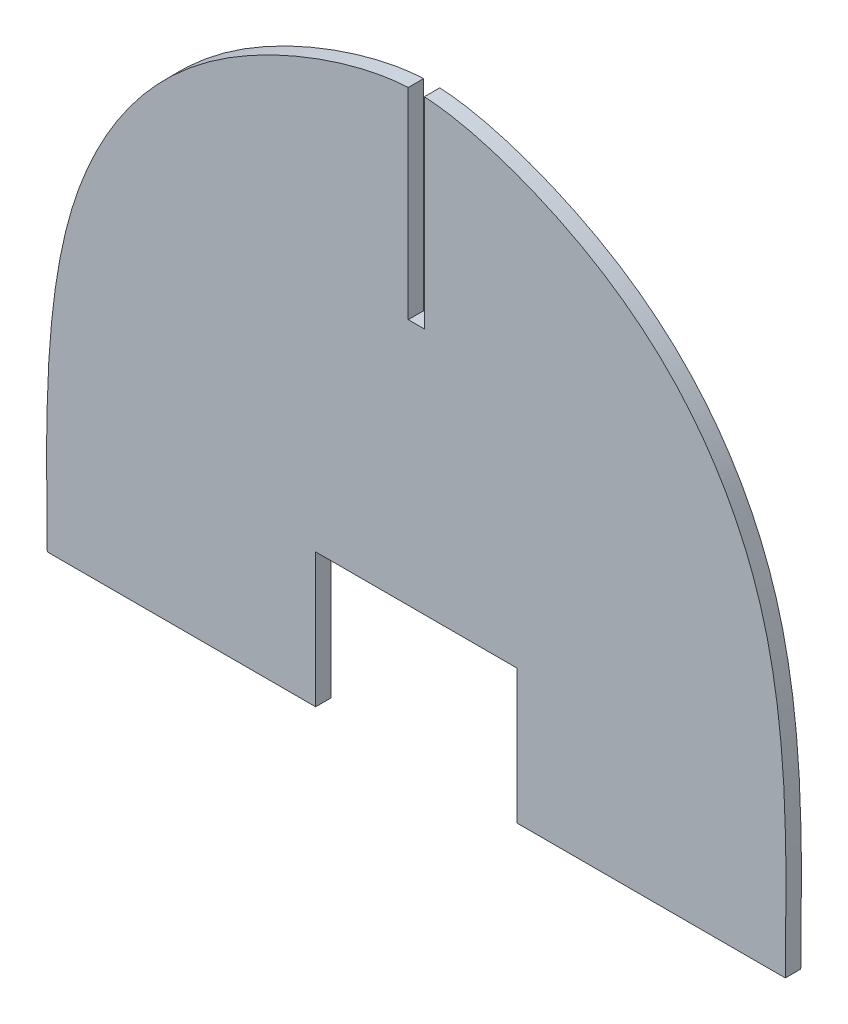
ISO-10303-21;
HEADER;
FILE_DESCRIPTION(('STEP AP214'),'2;1');
FILE_NAME('part.step','',(''),(''),'','','');
FILE_SCHEMA(('AUTOMOTIVE_DESIGN { 1 0 10303 214 1 1 1 1 }'));
ENDSEC;
DATA;
#1=APPLICATION_CONTEXT('core data for automotive mechanical design processes');
#2=APPLICATION_PROTOCOL_DEFINITION('international standard','automotive_design',2000,#1);
#3=PRODUCT_CONTEXT('',#1,'mechanical');
#4=PRODUCT('Part','Part','',(#3));
#5=PRODUCT_RELATED_PRODUCT_CATEGORY('part','',(#4));
#6=PRODUCT_DEFINITION_FORMATION('','',#4);
#7=PRODUCT_DEFINITION_CONTEXT('part definition',#1,'design');
#8=PRODUCT_DEFINITION('design','',#6,#7);
#9=PRODUCT_DEFINITION_SHAPE('','',#8);
#10=(LENGTH_UNIT() NAMED_UNIT(*) SI_UNIT(.MILLI.,.METRE.));
#11=(NAMED_UNIT(*) PLANE_ANGLE_UNIT() SI_UNIT($,.RADIAN.));
#12=(NAMED_UNIT(*) SI_UNIT($,.STERADIAN.) SOLID_ANGLE_UNIT());
#13=UNCERTAINTY_MEASURE_WITH_UNIT(LENGTH_MEASURE(1.E-05),#10,'distance_accuracy_value','');
#14=(GEOMETRIC_REPRESENTATION_CONTEXT(3) GLOBAL_UNCERTAINTY_ASSIGNED_CONTEXT((#13)) GLOBAL_UNIT_ASSIGNED_CONTEXT((#10,
#11,#12)) REPRESENTATION_CONTEXT('',''));
#15=CARTESIAN_POINT('',(0.,0.,0.));
#16=DIRECTION('',(0.,0.,1.));
#17=DIRECTION('',(1.,0.,0.));
#18=AXIS2_PLACEMENT_3D('',#15,#16,#17);
#19=CARTESIAN_POINT('',(118.997512610955,184.448403512434,5.842));
#20=DIRECTION('',(0.,0.,1.));
#21=DIRECTION('',(1.,0.,0.));
#22=AXIS2_PLACEMENT_3D('',#19,#20,#21);
#23=PLANE('',#22);
#24=CARTESIAN_POINT('',(139.7,39.6875,5.842));
#25=CARTESIAN_POINT('',(139.7,69.9500129469319,5.842));
#26=CARTESIAN_POINT('',(143.62824702491,143.243818772487,5.842));
#27=CARTESIAN_POINT('',(104.303414454819,213.336844907714,5.842));
#28=CARTESIAN_POINT('',(56.7758345880253,247.639527653271,5.842));
#29=CARTESIAN_POINT('',(16.0708765289729,260.35,5.842));
#30=CARTESIAN_POINT('',(0.,260.35,5.842));
#31=B_SPLINE_CURVE_WITH_KNOTS('',3,(#24,#25,#26,#27,#28,#29,#30),.UNSPECIFIED.,.F.,.F.,(4,1,1,1,
4),(0.,0.396278781345335,0.622595308530555,0.803486507770822,1.),.UNSPECIFIED.);
#32=CARTESIAN_POINT('',(139.7,39.6875,5.842));
#33=VERTEX_POINT('',#32);
#34=CARTESIAN_POINT('',(3.04800000974843,260.274610741652,5.842));
#35=VERTEX_POINT('',#34);
#36=EDGE_CURVE('E200',#33,#35,#31,.T.);
#37=ORIENTED_EDGE('',*,*,#36,.T.);
#38=DIRECTION('',(0.,-1.,0.));
#39=VECTOR('',#38,1.);
#40=CARTESIAN_POINT('',(3.048,260.35,5.842));
#41=LINE('',#40,#39);
#42=CARTESIAN_POINT('',(3.04800000000001,184.15,5.842));
#43=VERTEX_POINT('',#42);
#44=EDGE_CURVE('E48',#35,#43,#41,.T.);
#45=ORIENTED_EDGE('',*,*,#44,.T.);
#46=DIRECTION('',(1.,0.,0.));
#47=VECTOR('',#46,1.);
#48=CARTESIAN_POINT('',(0.,184.15,5.842));
#49=LINE('',#48,#47);
#50=CARTESIAN_POINT('',(-3.04800000000001,184.15,5.842));
#51=VERTEX_POINT('',#50);
#52=EDGE_CURVE('E110',#51,#43,#49,.T.);
#53=ORIENTED_EDGE('',*,*,#52,.F.);
#54=DIRECTION('',(0.,-1.,0.));
#55=VECTOR('',#54,1.);
#56=CARTESIAN_POINT('',(-3.048,260.35,5.842));
#57=LINE('',#56,#55);
#58=CARTESIAN_POINT('',(-3.04800000974843,260.274610741652,5.842));
#59=VERTEX_POINT('',#58);
#60=EDGE_CURVE('E115',#59,#51,#57,.T.);
#61=ORIENTED_EDGE('',*,*,#60,.F.);
#62=CARTESIAN_POINT('',(-139.7,39.6875,5.842));
#63=CARTESIAN_POINT('',(-139.7,69.9500129469319,5.842));
#64=CARTESIAN_POINT('',(-143.62824702491,143.243818772487,5.842));
#65=CARTESIAN_POINT('',(-104.303414454819,213.336844907714,5.842));
#66=CARTESIAN_POINT('',(-56.7758345880253,247.639527653271,5.842));
#67=CARTESIAN_POINT('',(-16.0708765289729,260.35,5.842));
#68=CARTESIAN_POINT('',(0.,260.35,5.842));
#69=B_SPLINE_CURVE_WITH_KNOTS('',3,(#62,#63,#64,#65,#66,#67,#68),.UNSPECIFIED.,.F.,.F.,(4,1,1,1,
4),(0.,0.396278781345335,0.622595308530555,0.803486507770822,1.),.UNSPECIFIED.);
#70=CARTESIAN_POINT('',(-139.7,39.6875,5.842));
#71=VERTEX_POINT('',#70);
#72=EDGE_CURVE('E148',#71,#59,#69,.T.);
#73=ORIENTED_EDGE('',*,*,#72,.F.);
#74=DIRECTION('',(-1.,0.,0.));
#75=VECTOR('',#74,1.);
#76=CARTESIAN_POINT('',(0.,39.6875,5.842));
#77=LINE('',#76,#75);
#78=CARTESIAN_POINT('',(-38.1,39.6875,5.842));
#79=VERTEX_POINT('',#78);
#80=EDGE_CURVE('E153',#79,#71,#77,.T.);
#81=ORIENTED_EDGE('',*,*,#80,.F.);
#82=DIRECTION('',(0.,1.,0.));
#83=VECTOR('',#82,1.);
#84=CARTESIAN_POINT('',(-38.1,39.6875,5.842));
#85=LINE('',#84,#83);
#86=CARTESIAN_POINT('',(-38.1,90.4875,5.842));
#87=VERTEX_POINT('',#86);
#88=EDGE_CURVE('E133',#79,#87,#85,.T.);
#89=ORIENTED_EDGE('',*,*,#88,.T.);
#90=DIRECTION('',(1.,0.,0.));
#91=VECTOR('',#90,1.);
#92=CARTESIAN_POINT('',(0.,90.4875,5.842));
#93=LINE('',#92,#91);
#94=CARTESIAN_POINT('',(38.1,90.4875,5.842));
#95=VERTEX_POINT('',#94);
#96=EDGE_CURVE('E229',#87,#95,#93,.T.);
#97=ORIENTED_EDGE('',*,*,#96,.T.);
#98=DIRECTION('',(0.,1.,0.));
#99=VECTOR('',#98,1.);
#100=CARTESIAN_POINT('',(38.1,39.6875,5.842));
#101=LINE('',#100,#99);
#102=CARTESIAN_POINT('',(38.1,39.6875,5.842));
#103=VERTEX_POINT('',#102);
#104=EDGE_CURVE('E227',#103,#95,#101,.T.);
#105=ORIENTED_EDGE('',*,*,#104,.F.);
#106=DIRECTION('',(1.,0.,0.));
#107=VECTOR('',#106,1.);
#108=CARTESIAN_POINT('',(0.,39.6875,5.842));
#109=LINE('',#108,#107);
#110=EDGE_CURVE('E194',#103,#33,#109,.T.);
#111=ORIENTED_EDGE('',*,*,#110,.T.);
#112=EDGE_LOOP('',(#37,#45,#53,#61,#73,#81,#89,#97,#105,#111));
#113=FACE_BOUND('',#112,.T.);
#114=ADVANCED_FACE('F33',(#113),#23,.T.);
#115=CARTESIAN_POINT('',(118.997512610955,184.448403512434,0.));
#116=DIRECTION('',(0.,0.,1.));
#117=DIRECTION('',(1.,0.,0.));
#118=AXIS2_PLACEMENT_3D('',#115,#116,#117);
#119=PLANE('',#118);
#120=DIRECTION('',(0.,-1.,0.));
#121=VECTOR('',#120,1.);
#122=CARTESIAN_POINT('',(3.048,260.35,0.));
#123=LINE('',#122,#121);
#124=CARTESIAN_POINT('',(3.048,260.274610741652,0.));
#125=VERTEX_POINT('',#124);
#126=CARTESIAN_POINT('',(3.04800000000001,184.15,0.));
#127=VERTEX_POINT('',#126);
#128=EDGE_CURVE('E119',#125,#127,#123,.T.);
#129=ORIENTED_EDGE('',*,*,#128,.F.);
#130=CARTESIAN_POINT('',(139.7,39.6875,0.));
#131=CARTESIAN_POINT('',(139.7,69.9500129469319,0.));
#132=CARTESIAN_POINT('',(143.62824702491,143.243818772487,0.));
#133=CARTESIAN_POINT('',(104.303414454819,213.336844907714,0.));
#134=CARTESIAN_POINT('',(56.7758345880253,247.639527653271,0.));
#135=CARTESIAN_POINT('',(16.0708765289729,260.35,0.));
#136=CARTESIAN_POINT('',(0.,260.35,0.));
#137=B_SPLINE_CURVE_WITH_KNOTS('',3,(#130,#131,#132,#133,#134,#135,#136),.UNSPECIFIED.,.F.,.F.,
(4,1,1,1,4),(0.,0.396278781345335,0.622595308530555,0.803486507770822,1.),.UNSPECIFIED.);
#138=CARTESIAN_POINT('',(139.7,39.6875,0.));
#139=VERTEX_POINT('',#138);
#140=EDGE_CURVE('E208',#139,#125,#137,.T.);
#141=ORIENTED_EDGE('',*,*,#140,.F.);
#142=DIRECTION('',(1.,0.,0.));
#143=VECTOR('',#142,1.);
#144=CARTESIAN_POINT('',(0.,39.6875,0.));
#145=LINE('',#144,#143);
#146=CARTESIAN_POINT('',(38.1,39.6875,0.));
#147=VERTEX_POINT('',#146);
#148=EDGE_CURVE('E202',#147,#139,#145,.T.);
#149=ORIENTED_EDGE('',*,*,#148,.F.);
#150=DIRECTION('',(0.,1.,0.));
#151=VECTOR('',#150,1.);
#152=CARTESIAN_POINT('',(38.1,39.6875,0.));
#153=LINE('',#152,#151);
#154=CARTESIAN_POINT('',(38.1,90.4875,0.));
#155=VERTEX_POINT('',#154);
#156=EDGE_CURVE('E226',#147,#155,#153,.T.);
#157=ORIENTED_EDGE('',*,*,#156,.T.);
#158=DIRECTION('',(1.,0.,0.));
#159=VECTOR('',#158,1.);
#160=CARTESIAN_POINT('',(0.,90.4875,0.));
#161=LINE('',#160,#159);
#162=CARTESIAN_POINT('',(-38.1,90.4875,0.));
#163=VERTEX_POINT('',#162);
#164=EDGE_CURVE('E224',#163,#155,#161,.T.);
#165=ORIENTED_EDGE('',*,*,#164,.F.);
#166=DIRECTION('',(0.,1.,0.));
#167=VECTOR('',#166,1.);
#168=CARTESIAN_POINT('',(-38.1,39.6875,0.));
#169=LINE('',#168,#167);
#170=CARTESIAN_POINT('',(-38.1,39.6875,0.));
#171=VERTEX_POINT('',#170);
#172=EDGE_CURVE('E136',#171,#163,#169,.T.);
#173=ORIENTED_EDGE('',*,*,#172,.F.);
#174=DIRECTION('',(-1.,0.,0.));
#175=VECTOR('',#174,1.);
#176=CARTESIAN_POINT('',(0.,39.6875,0.));
#177=LINE('',#176,#175);
#178=CARTESIAN_POINT('',(-139.7,39.6875,0.));
#179=VERTEX_POINT('',#178);
#180=EDGE_CURVE('E154',#171,#179,#177,.T.);
#181=ORIENTED_EDGE('',*,*,#180,.T.);
#182=CARTESIAN_POINT('',(-139.7,39.6875,0.));
#183=CARTESIAN_POINT('',(-139.7,69.9500129469319,0.));
#184=CARTESIAN_POINT('',(-143.62824702491,143.243818772487,0.));
#185=CARTESIAN_POINT('',(-104.303414454819,213.336844907714,0.));
#186=CARTESIAN_POINT('',(-56.7758345880253,247.639527653271,0.));
#187=CARTESIAN_POINT('',(-16.0708765289729,260.35,0.));
#188=CARTESIAN_POINT('',(0.,260.35,0.));
#189=B_SPLINE_CURVE_WITH_KNOTS('',3,(#182,#183,#184,#185,#186,#187,#188),.UNSPECIFIED.,.F.,.F.,
(4,1,1,1,4),(0.,0.396278781345335,0.622595308530555,0.803486507770822,1.),.UNSPECIFIED.);
#190=CARTESIAN_POINT('',(-3.048,260.274610741652,0.));
#191=VERTEX_POINT('',#190);
#192=EDGE_CURVE('E147',#179,#191,#189,.T.);
#193=ORIENTED_EDGE('',*,*,#192,.T.);
#194=DIRECTION('',(0.,-1.,0.));
#195=VECTOR('',#194,1.);
#196=CARTESIAN_POINT('',(-3.048,260.35,0.));
#197=LINE('',#196,#195);
#198=CARTESIAN_POINT('',(-3.04800000000001,184.15,0.));
#199=VERTEX_POINT('',#198);
#200=EDGE_CURVE('E129',#191,#199,#197,.T.);
#201=ORIENTED_EDGE('',*,*,#200,.T.);
#202=DIRECTION('',(1.,0.,0.));
#203=VECTOR('',#202,1.);
#204=CARTESIAN_POINT('',(0.,184.15,0.));
#205=LINE('',#204,#203);
#206=EDGE_CURVE('E125',#199,#127,#205,.T.);
#207=ORIENTED_EDGE('',*,*,#206,.T.);
#208=EDGE_LOOP('',(#129,#141,#149,#157,#165,#173,#181,#193,#201,#207));
#209=FACE_BOUND('',#208,.T.);
#210=ADVANCED_FACE('F182',(#209),#119,.F.);
#211=DIRECTION('',(0.,0.,-1.));
#212=VECTOR('',#211,1.);
#213=SURFACE_OF_LINEAR_EXTRUSION('',#31,#212);
#214=DIRECTION('',(0.,0.,-1.));
#215=VECTOR('',#214,1.);
#216=CARTESIAN_POINT('',(3.04799999999998,260.274610742122,5.842));
#217=LINE('',#216,#215);
#218=EDGE_CURVE('E11',#35,#125,#217,.T.);
#219=ORIENTED_EDGE('',*,*,#218,.F.);
#220=ORIENTED_EDGE('',*,*,#36,.F.);
#221=DIRECTION('',(0.,0.,-1.));
#222=VECTOR('',#221,1.);
#223=CARTESIAN_POINT('',(139.7,39.6875,5.842));
#224=LINE('',#223,#222);
#225=EDGE_CURVE('E42',#33,#139,#224,.T.);
#226=ORIENTED_EDGE('',*,*,#225,.T.);
#227=ORIENTED_EDGE('',*,*,#140,.T.);
#228=EDGE_LOOP('',(#219,#220,#226,#227));
#229=FACE_BOUND('',#228,.T.);
#230=ADVANCED_FACE('F35',(#229),#213,.F.);
#231=CARTESIAN_POINT('',(0.,39.6875,5.842));
#232=DIRECTION('',(0.,1.,0.));
#233=DIRECTION('',(-1.,0.,0.));
#234=AXIS2_PLACEMENT_3D('',#231,#232,#233);
#235=PLANE('',#234);
#236=ORIENTED_EDGE('',*,*,#110,.F.);
#237=DIRECTION('',(0.,0.,1.));
#238=VECTOR('',#237,1.);
#239=CARTESIAN_POINT('',(38.1,39.6875,0.));
#240=LINE('',#239,#238);
#241=EDGE_CURVE('E195',#147,#103,#240,.T.);
#242=ORIENTED_EDGE('',*,*,#241,.F.);
#243=ORIENTED_EDGE('',*,*,#148,.T.);
#244=ORIENTED_EDGE('',*,*,#225,.F.);
#245=EDGE_LOOP('',(#236,#242,#243,#244));
#246=FACE_BOUND('',#245,.T.);
#247=ADVANCED_FACE('F178',(#246),#235,.F.);
#248=CARTESIAN_POINT('',(0.,90.4875,0.));
#249=DIRECTION('',(0.,-1.,0.));
#250=DIRECTION('',(0.,0.,-1.));
#251=AXIS2_PLACEMENT_3D('',#248,#249,#250);
#252=PLANE('',#251);
#253=ORIENTED_EDGE('',*,*,#96,.F.);
#254=DIRECTION('',(0.,0.,1.));
#255=VECTOR('',#254,1.);
#256=CARTESIAN_POINT('',(-38.1,90.4875,0.));
#257=LINE('',#256,#255);
#258=EDGE_CURVE('E144',#163,#87,#257,.T.);
#259=ORIENTED_EDGE('',*,*,#258,.F.);
#260=ORIENTED_EDGE('',*,*,#164,.T.);
#261=DIRECTION('',(0.,0.,1.));
#262=VECTOR('',#261,1.);
#263=CARTESIAN_POINT('',(38.1,90.4875,0.));
#264=LINE('',#263,#262);
#265=EDGE_CURVE('E56',#155,#95,#264,.T.);
#266=ORIENTED_EDGE('',*,*,#265,.T.);
#267=EDGE_LOOP('',(#253,#259,#260,#266));
#268=FACE_BOUND('',#267,.T.);
#269=ADVANCED_FACE('F175',(#268),#252,.T.);
#270=CARTESIAN_POINT('',(38.1,39.6875,0.));
#271=DIRECTION('',(1.,0.,0.));
#272=DIRECTION('',(0.,0.,-1.));
#273=AXIS2_PLACEMENT_3D('',#270,#271,#272);
#274=PLANE('',#273);
#275=ORIENTED_EDGE('',*,*,#104,.T.);
#276=ORIENTED_EDGE('',*,*,#265,.F.);
#277=ORIENTED_EDGE('',*,*,#156,.F.);
#278=ORIENTED_EDGE('',*,*,#241,.T.);
#279=EDGE_LOOP('',(#275,#276,#277,#278));
#280=FACE_BOUND('',#279,.T.);
#281=ADVANCED_FACE('F170',(#280),#274,.F.);
#282=CARTESIAN_POINT('',(3.048,260.35,0.));
#283=DIRECTION('',(-1.,0.,0.));
#284=DIRECTION('',(0.,-1.,0.));
#285=AXIS2_PLACEMENT_3D('',#282,#283,#284);
#286=PLANE('',#285);
#287=ORIENTED_EDGE('',*,*,#218,.T.);
#288=ORIENTED_EDGE('',*,*,#128,.T.);
#289=DIRECTION('',(0.,0.,1.));
#290=VECTOR('',#289,1.);
#291=CARTESIAN_POINT('',(3.04800000000001,184.15,0.));
#292=LINE('',#291,#290);
#293=EDGE_CURVE('E220',#127,#43,#292,.T.);
#294=ORIENTED_EDGE('',*,*,#293,.T.);
#295=ORIENTED_EDGE('',*,*,#44,.F.);
#296=EDGE_LOOP('',(#287,#288,#294,#295));
#297=FACE_BOUND('',#296,.T.);
#298=ADVANCED_FACE('F167',(#297),#286,.T.);
#299=CARTESIAN_POINT('',(0.,184.15,0.));
#300=DIRECTION('',(0.,-1.,0.));
#301=DIRECTION('',(0.,0.,-1.));
#302=AXIS2_PLACEMENT_3D('',#299,#300,#301);
#303=PLANE('',#302);
#304=ORIENTED_EDGE('',*,*,#52,.T.);
#305=ORIENTED_EDGE('',*,*,#293,.F.);
#306=ORIENTED_EDGE('',*,*,#206,.F.);
#307=DIRECTION('',(0.,0.,1.));
#308=VECTOR('',#307,1.);
#309=CARTESIAN_POINT('',(-3.04800000000001,184.15,0.));
#310=LINE('',#309,#308);
#311=EDGE_CURVE('E122',#199,#51,#310,.T.);
#312=ORIENTED_EDGE('',*,*,#311,.T.);
#313=EDGE_LOOP('',(#304,#305,#306,#312));
#314=FACE_BOUND('',#313,.T.);
#315=ADVANCED_FACE('F123',(#314),#303,.F.);
#316=DIRECTION('',(0.,0.,-1.));
#317=VECTOR('',#316,1.);
#318=SURFACE_OF_LINEAR_EXTRUSION('',#69,#317);
#319=DIRECTION('',(0.,0.,-1.));
#320=VECTOR('',#319,1.);
#321=CARTESIAN_POINT('',(-3.04799999999998,260.274610742122,5.842));
#322=LINE('',#321,#320);
#323=EDGE_CURVE('E132',#59,#191,#322,.T.);
#324=ORIENTED_EDGE('',*,*,#323,.T.);
#325=ORIENTED_EDGE('',*,*,#192,.F.);
#326=DIRECTION('',(0.,0.,-1.));
#327=VECTOR('',#326,1.);
#328=CARTESIAN_POINT('',(-139.7,39.6875,5.842));
#329=LINE('',#328,#327);
#330=EDGE_CURVE('E249',#71,#179,#329,.T.);
#331=ORIENTED_EDGE('',*,*,#330,.F.);
#332=ORIENTED_EDGE('',*,*,#72,.T.);
#333=EDGE_LOOP('',(#324,#325,#331,#332));
#334=FACE_BOUND('',#333,.T.);
#335=ADVANCED_FACE('F160',(#334),#318,.T.);
#336=CARTESIAN_POINT('',(0.,39.6875,5.842));
#337=DIRECTION('',(0.,1.,0.));
#338=DIRECTION('',(1.,0.,0.));
#339=AXIS2_PLACEMENT_3D('',#336,#337,#338);
#340=PLANE('',#339);
#341=ORIENTED_EDGE('',*,*,#80,.T.);
#342=ORIENTED_EDGE('',*,*,#330,.T.);
#343=ORIENTED_EDGE('',*,*,#180,.F.);
#344=DIRECTION('',(0.,0.,1.));
#345=VECTOR('',#344,1.);
#346=CARTESIAN_POINT('',(-38.1,39.6875,0.));
#347=LINE('',#346,#345);
#348=EDGE_CURVE('E141',#171,#79,#347,.T.);
#349=ORIENTED_EDGE('',*,*,#348,.T.);
#350=EDGE_LOOP('',(#341,#342,#343,#349));
#351=FACE_BOUND('',#350,.T.);
#352=ADVANCED_FACE('F164',(#351),#340,.F.);
#353=CARTESIAN_POINT('',(-38.1,39.6875,0.));
#354=DIRECTION('',(-1.,0.,0.));
#355=DIRECTION('',(0.,0.,-1.));
#356=AXIS2_PLACEMENT_3D('',#353,#354,#355);
#357=PLANE('',#356);
#358=ORIENTED_EDGE('',*,*,#88,.F.);
#359=ORIENTED_EDGE('',*,*,#348,.F.);
#360=ORIENTED_EDGE('',*,*,#172,.T.);
#361=ORIENTED_EDGE('',*,*,#258,.T.);
#362=EDGE_LOOP('',(#358,#359,#360,#361));
#363=FACE_BOUND('',#362,.T.);
#364=ADVANCED_FACE('F238',(#363),#357,.F.);
#365=CARTESIAN_POINT('',(-3.048,260.35,0.));
#366=DIRECTION('',(1.,0.,0.));
#367=DIRECTION('',(0.,-1.,0.));
#368=AXIS2_PLACEMENT_3D('',#365,#366,#367);
#369=PLANE('',#368);
#370=ORIENTED_EDGE('',*,*,#323,.F.);
#371=ORIENTED_EDGE('',*,*,#60,.T.);
#372=ORIENTED_EDGE('',*,*,#311,.F.);
#373=ORIENTED_EDGE('',*,*,#200,.F.);
#374=EDGE_LOOP('',(#370,#371,#372,#373));
#375=FACE_BOUND('',#374,.T.);
#376=ADVANCED_FACE('F131',(#375),#369,.T.);
#377=CLOSED_SHELL('',(#114,#210,#230,#247,#269,#281,#298,#315,#335,#352,#364,#376));
#378=MANIFOLD_SOLID_BREP('B2',#377);
#379=ADVANCED_BREP_SHAPE_REPRESENTATION('',(#18,#378),#14);
#380=SHAPE_DEFINITION_REPRESENTATION(#9,#379);
ENDSEC;
END-ISO-10303-21;
